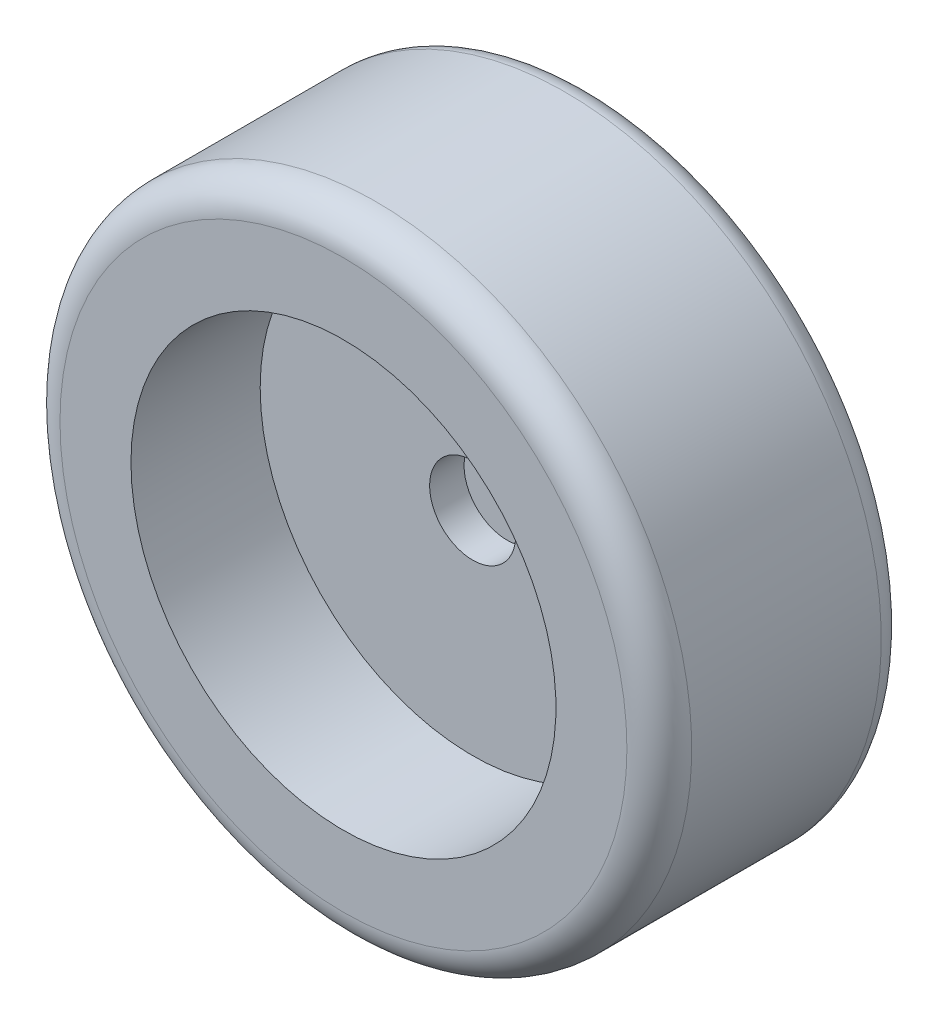
ISO-10303-21;
HEADER;
FILE_DESCRIPTION(('STEP AP214'),'2;1');
FILE_NAME('part.step','',(''),(''),'','','');
FILE_SCHEMA(('AUTOMOTIVE_DESIGN { 1 0 10303 214 1 1 1 1 }'));
ENDSEC;
DATA;
#1=APPLICATION_CONTEXT('core data for automotive mechanical design processes');
#2=APPLICATION_PROTOCOL_DEFINITION('international standard','automotive_design',2000,#1);
#3=PRODUCT_CONTEXT('',#1,'mechanical');
#4=PRODUCT('Part','Part','',(#3));
#5=PRODUCT_RELATED_PRODUCT_CATEGORY('part','',(#4));
#6=PRODUCT_DEFINITION_FORMATION('','',#4);
#7=PRODUCT_DEFINITION_CONTEXT('part definition',#1,'design');
#8=PRODUCT_DEFINITION('design','',#6,#7);
#9=PRODUCT_DEFINITION_SHAPE('','',#8);
#10=(LENGTH_UNIT() NAMED_UNIT(*) SI_UNIT(.MILLI.,.METRE.));
#11=(NAMED_UNIT(*) PLANE_ANGLE_UNIT() SI_UNIT($,.RADIAN.));
#12=(NAMED_UNIT(*) SI_UNIT($,.STERADIAN.) SOLID_ANGLE_UNIT());
#13=UNCERTAINTY_MEASURE_WITH_UNIT(LENGTH_MEASURE(1.E-05),#10,'distance_accuracy_value','');
#14=(GEOMETRIC_REPRESENTATION_CONTEXT(3) GLOBAL_UNCERTAINTY_ASSIGNED_CONTEXT((#13)) GLOBAL_UNIT_ASSIGNED_CONTEXT((#10,
#11,#12)) REPRESENTATION_CONTEXT('',''));
#15=CARTESIAN_POINT('',(0.,0.,0.));
#16=DIRECTION('',(0.,0.,1.));
#17=DIRECTION('',(1.,0.,0.));
#18=AXIS2_PLACEMENT_3D('',#15,#16,#17);
#19=CARTESIAN_POINT('',(0.,0.,43.));
#20=DIRECTION('',(0.,0.,-1.));
#21=DIRECTION('',(-1.,0.,0.));
#22=AXIS2_PLACEMENT_3D('',#19,#20,#21);
#23=CYLINDRICAL_SURFACE('',#22,7.5);
#24=CARTESIAN_POINT('',(0.,0.,14.5));
#25=DIRECTION('',(0.,0.,-1.));
#26=DIRECTION('',(-1.,0.,0.));
#27=AXIS2_PLACEMENT_3D('',#24,#25,#26);
#28=CIRCLE('',#27,7.5);
#29=CARTESIAN_POINT('',(-7.5,0.,14.5));
#30=VERTEX_POINT('',#29);
#31=EDGE_CURVE('E10',#30,#30,#28,.T.);
#32=ORIENTED_EDGE('',*,*,#31,.T.);
#33=EDGE_LOOP('',(#32));
#34=FACE_BOUND('',#33,.T.);
#35=CARTESIAN_POINT('',(0.,0.,20.5));
#36=DIRECTION('',(0.,0.,-1.));
#37=DIRECTION('',(-1.,0.,0.));
#38=AXIS2_PLACEMENT_3D('',#35,#36,#37);
#39=CIRCLE('',#38,7.5);
#40=CARTESIAN_POINT('',(-7.5,0.,20.5));
#41=VERTEX_POINT('',#40);
#42=EDGE_CURVE('E76',#41,#41,#39,.T.);
#43=ORIENTED_EDGE('',*,*,#42,.F.);
#44=EDGE_LOOP('',(#43));
#45=FACE_BOUND('',#44,.T.);
#46=ADVANCED_FACE('F41',(#34,#45),#23,.F.);
#47=CARTESIAN_POINT('',(7.5,0.,14.5));
#48=DIRECTION('',(0.,0.,1.));
#49=DIRECTION('',(1.,0.,0.));
#50=AXIS2_PLACEMENT_3D('',#47,#48,#49);
#51=PLANE('',#50);
#52=ORIENTED_EDGE('',*,*,#31,.F.);
#53=EDGE_LOOP('',(#52));
#54=FACE_BOUND('',#53,.T.);
#55=ADVANCED_FACE('F85',(#54),#51,.T.);
#56=CARTESIAN_POINT('',(0.,0.,0.));
#57=DIRECTION('',(0.,0.,-1.));
#58=DIRECTION('',(-1.,0.,0.));
#59=AXIS2_PLACEMENT_3D('',#56,#57,#58);
#60=PLANE('',#59);
#61=CARTESIAN_POINT('',(0.,0.,0.));
#62=DIRECTION('',(0.,0.,-1.));
#63=DIRECTION('',(-1.,0.,0.));
#64=AXIS2_PLACEMENT_3D('',#61,#62,#63);
#65=CIRCLE('',#64,50.6432547904911);
#66=CARTESIAN_POINT('',(-50.6432547904911,0.,0.));
#67=VERTEX_POINT('',#66);
#68=EDGE_CURVE('E48',#67,#67,#65,.T.);
#69=ORIENTED_EDGE('',*,*,#68,.T.);
#70=EDGE_LOOP('',(#69));
#71=FACE_BOUND('',#70,.T.);
#72=ADVANCED_FACE('F89',(#71),#60,.T.);
#73=CARTESIAN_POINT('',(0.,0.,4.35674520950893));
#74=DIRECTION('',(0.,0.,-1.));
#75=DIRECTION('',(-1.,0.,0.));
#76=AXIS2_PLACEMENT_3D('',#73,#74,#75);
#77=TOROIDAL_SURFACE('',#76,50.6432547904911,4.35674520950893);
#78=CARTESIAN_POINT('',(0.,0.,4.35674520950893));
#79=DIRECTION('',(0.,0.,-1.));
#80=DIRECTION('',(-1.,0.,0.));
#81=AXIS2_PLACEMENT_3D('',#78,#79,#80);
#82=CIRCLE('',#81,55.);
#83=CARTESIAN_POINT('',(-55.,0.,4.35674520950893));
#84=VERTEX_POINT('',#83);
#85=EDGE_CURVE('E53',#84,#84,#82,.T.);
#86=ORIENTED_EDGE('',*,*,#85,.T.);
#87=EDGE_LOOP('',(#86));
#88=FACE_BOUND('',#87,.T.);
#89=ORIENTED_EDGE('',*,*,#68,.F.);
#90=EDGE_LOOP('',(#89));
#91=FACE_BOUND('',#90,.T.);
#92=ADVANCED_FACE('F94',(#88,#91),#77,.T.);
#93=CARTESIAN_POINT('',(0.,0.,43.));
#94=DIRECTION('',(0.,0.,-1.));
#95=DIRECTION('',(-1.,0.,0.));
#96=AXIS2_PLACEMENT_3D('',#93,#94,#95);
#97=CYLINDRICAL_SURFACE('',#96,55.);
#98=CARTESIAN_POINT('',(0.,0.,37.3567452095089));
#99=DIRECTION('',(0.,0.,-1.));
#100=DIRECTION('',(-1.,0.,0.));
#101=AXIS2_PLACEMENT_3D('',#98,#99,#100);
#102=CIRCLE('',#101,55.);
#103=CARTESIAN_POINT('',(-55.,0.,37.3567452095089));
#104=VERTEX_POINT('',#103);
#105=EDGE_CURVE('E58',#104,#104,#102,.T.);
#106=ORIENTED_EDGE('',*,*,#105,.T.);
#107=EDGE_LOOP('',(#106));
#108=FACE_BOUND('',#107,.T.);
#109=ORIENTED_EDGE('',*,*,#85,.F.);
#110=EDGE_LOOP('',(#109));
#111=FACE_BOUND('',#110,.T.);
#112=ADVANCED_FACE('F99',(#108,#111),#97,.T.);
#113=CARTESIAN_POINT('',(0.,0.,37.3567452095089));
#114=DIRECTION('',(0.,0.,-1.));
#115=DIRECTION('',(-1.,0.,0.));
#116=AXIS2_PLACEMENT_3D('',#113,#114,#115);
#117=TOROIDAL_SURFACE('',#116,49.3567452095089,5.64325479049108);
#118=CARTESIAN_POINT('',(0.,0.,43.));
#119=DIRECTION('',(0.,0.,-1.));
#120=DIRECTION('',(-1.,0.,0.));
#121=AXIS2_PLACEMENT_3D('',#118,#119,#120);
#122=CIRCLE('',#121,49.3567452095089);
#123=CARTESIAN_POINT('',(-49.3567452095089,0.,43.));
#124=VERTEX_POINT('',#123);
#125=EDGE_CURVE('E64',#124,#124,#122,.T.);
#126=ORIENTED_EDGE('',*,*,#125,.T.);
#127=EDGE_LOOP('',(#126));
#128=FACE_BOUND('',#127,.T.);
#129=ORIENTED_EDGE('',*,*,#105,.F.);
#130=EDGE_LOOP('',(#129));
#131=FACE_BOUND('',#130,.T.);
#132=ADVANCED_FACE('F103',(#128,#131),#117,.T.);
#133=CARTESIAN_POINT('',(49.3567452095089,0.,43.));
#134=DIRECTION('',(0.,0.,1.));
#135=DIRECTION('',(1.,0.,0.));
#136=AXIS2_PLACEMENT_3D('',#133,#134,#135);
#137=PLANE('',#136);
#138=CARTESIAN_POINT('',(0.,0.,43.));
#139=DIRECTION('',(0.,0.,-1.));
#140=DIRECTION('',(-1.,0.,0.));
#141=AXIS2_PLACEMENT_3D('',#138,#139,#140);
#142=CIRCLE('',#141,37.);
#143=CARTESIAN_POINT('',(-37.,0.,43.));
#144=VERTEX_POINT('',#143);
#145=EDGE_CURVE('E68',#144,#144,#142,.T.);
#146=ORIENTED_EDGE('',*,*,#145,.T.);
#147=EDGE_LOOP('',(#146));
#148=FACE_BOUND('',#147,.T.);
#149=ORIENTED_EDGE('',*,*,#125,.F.);
#150=EDGE_LOOP('',(#149));
#151=FACE_BOUND('',#150,.T.);
#152=ADVANCED_FACE('F107',(#148,#151),#137,.T.);
#153=CARTESIAN_POINT('',(0.,0.,43.));
#154=DIRECTION('',(0.,0.,-1.));
#155=DIRECTION('',(-1.,0.,0.));
#156=AXIS2_PLACEMENT_3D('',#153,#154,#155);
#157=CYLINDRICAL_SURFACE('',#156,37.);
#158=CARTESIAN_POINT('',(0.,0.,20.5));
#159=DIRECTION('',(0.,0.,-1.));
#160=DIRECTION('',(-1.,0.,0.));
#161=AXIS2_PLACEMENT_3D('',#158,#159,#160);
#162=CIRCLE('',#161,37.);
#163=CARTESIAN_POINT('',(-37.,0.,20.5));
#164=VERTEX_POINT('',#163);
#165=EDGE_CURVE('E72',#164,#164,#162,.T.);
#166=ORIENTED_EDGE('',*,*,#165,.T.);
#167=EDGE_LOOP('',(#166));
#168=FACE_BOUND('',#167,.T.);
#169=ORIENTED_EDGE('',*,*,#145,.F.);
#170=EDGE_LOOP('',(#169));
#171=FACE_BOUND('',#170,.T.);
#172=ADVANCED_FACE('F111',(#168,#171),#157,.F.);
#173=CARTESIAN_POINT('',(37.,0.,20.5));
#174=DIRECTION('',(0.,0.,1.));
#175=DIRECTION('',(1.,0.,0.));
#176=AXIS2_PLACEMENT_3D('',#173,#174,#175);
#177=PLANE('',#176);
#178=ORIENTED_EDGE('',*,*,#42,.T.);
#179=EDGE_LOOP('',(#178));
#180=FACE_BOUND('',#179,.T.);
#181=ORIENTED_EDGE('',*,*,#165,.F.);
#182=EDGE_LOOP('',(#181));
#183=FACE_BOUND('',#182,.T.);
#184=ADVANCED_FACE('F81',(#180,#183),#177,.T.);
#185=CLOSED_SHELL('',(#46,#55,#72,#92,#112,#132,#152,#172,#184));
#186=MANIFOLD_SOLID_BREP('B2',#185);
#187=ADVANCED_BREP_SHAPE_REPRESENTATION('',(#18,#186),#14);
#188=SHAPE_DEFINITION_REPRESENTATION(#9,#187);
ENDSEC;
END-ISO-10303-21;
